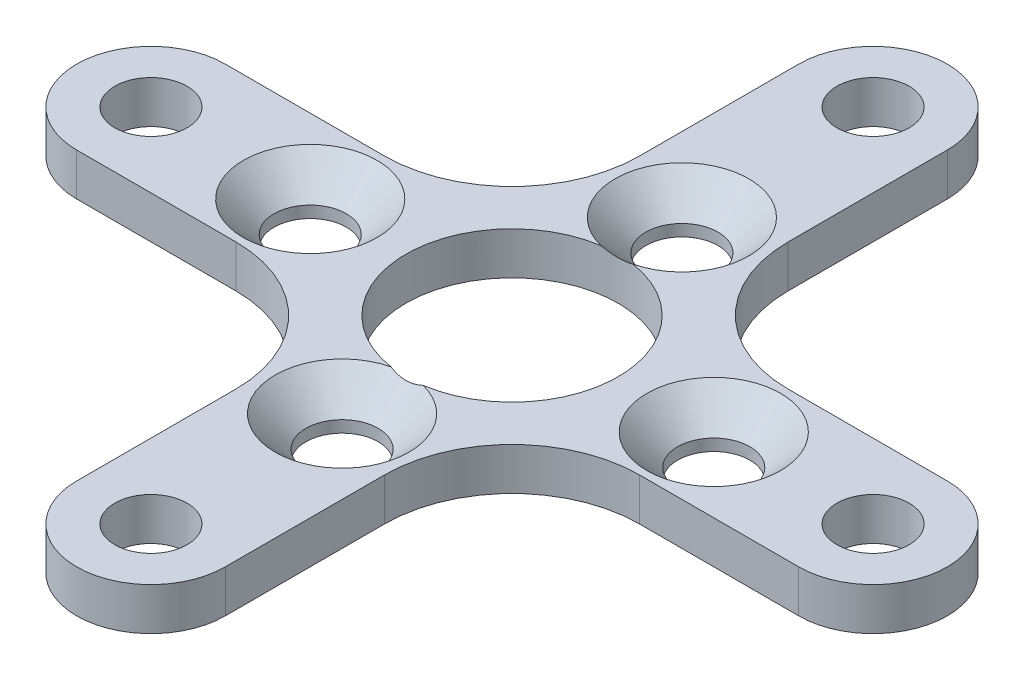
ISO-10303-21;
HEADER;
FILE_DESCRIPTION(('STEP AP214'),'2;1');
FILE_NAME('part.step','',(''),(''),'','','');
FILE_SCHEMA(('AUTOMOTIVE_DESIGN { 1 0 10303 214 1 1 1 1 }'));
ENDSEC;
DATA;
#1=APPLICATION_CONTEXT('core data for automotive mechanical design processes');
#2=APPLICATION_PROTOCOL_DEFINITION('international standard','automotive_design',2000,#1);
#3=PRODUCT_CONTEXT('',#1,'mechanical');
#4=PRODUCT('Part','Part','',(#3));
#5=PRODUCT_RELATED_PRODUCT_CATEGORY('part','',(#4));
#6=PRODUCT_DEFINITION_FORMATION('','',#4);
#7=PRODUCT_DEFINITION_CONTEXT('part definition',#1,'design');
#8=PRODUCT_DEFINITION('design','',#6,#7);
#9=PRODUCT_DEFINITION_SHAPE('','',#8);
#10=(LENGTH_UNIT() NAMED_UNIT(*) SI_UNIT(.MILLI.,.METRE.));
#11=(NAMED_UNIT(*) PLANE_ANGLE_UNIT() SI_UNIT($,.RADIAN.));
#12=(NAMED_UNIT(*) SI_UNIT($,.STERADIAN.) SOLID_ANGLE_UNIT());
#13=UNCERTAINTY_MEASURE_WITH_UNIT(LENGTH_MEASURE(1.E-05),#10,'distance_accuracy_value','');
#14=(GEOMETRIC_REPRESENTATION_CONTEXT(3) GLOBAL_UNCERTAINTY_ASSIGNED_CONTEXT((#13)) GLOBAL_UNIT_ASSIGNED_CONTEXT((#10,
#11,#12)) REPRESENTATION_CONTEXT('',''));
#15=CARTESIAN_POINT('',(0.,0.,0.));
#16=DIRECTION('',(0.,0.,1.));
#17=DIRECTION('',(1.,0.,0.));
#18=AXIS2_PLACEMENT_3D('',#15,#16,#17);
#19=CARTESIAN_POINT('',(9.5,2.,-9.5));
#20=DIRECTION('',(0.,-1.,0.));
#21=DIRECTION('',(0.,0.,-1.));
#22=AXIS2_PLACEMENT_3D('',#19,#20,#21);
#23=PLANE('',#22);
#24=CARTESIAN_POINT('',(-9.5,2.,0.));
#25=DIRECTION('',(0.,1.,0.));
#26=DIRECTION('',(0.,0.,1.));
#27=AXIS2_PLACEMENT_3D('',#24,#25,#26);
#28=CIRCLE('',#27,3.15);
#29=CARTESIAN_POINT('',(-9.5,2.,3.15));
#30=VERTEX_POINT('',#29);
#31=EDGE_CURVE('E554',#30,#30,#28,.T.);
#32=ORIENTED_EDGE('',*,*,#31,.F.);
#33=EDGE_LOOP('',(#32));
#34=FACE_BOUND('',#33,.T.);
#35=CARTESIAN_POINT('',(9.5,2.,0.));
#36=DIRECTION('',(0.,1.,0.));
#37=DIRECTION('',(0.,0.,1.));
#38=AXIS2_PLACEMENT_3D('',#35,#36,#37);
#39=CIRCLE('',#38,3.15);
#40=CARTESIAN_POINT('',(9.5,2.,3.15));
#41=VERTEX_POINT('',#40);
#42=EDGE_CURVE('E572',#41,#41,#39,.T.);
#43=ORIENTED_EDGE('',*,*,#42,.F.);
#44=EDGE_LOOP('',(#43));
#45=FACE_BOUND('',#44,.T.);
#46=CARTESIAN_POINT('',(0.,2.,-17.));
#47=DIRECTION('',(0.,1.,0.));
#48=DIRECTION('',(0.,0.,1.));
#49=AXIS2_PLACEMENT_3D('',#46,#47,#48);
#50=CIRCLE('',#49,1.7);
#51=CARTESIAN_POINT('',(0.,2.,-15.3));
#52=VERTEX_POINT('',#51);
#53=EDGE_CURVE('E581',#52,#52,#50,.T.);
#54=ORIENTED_EDGE('',*,*,#53,.F.);
#55=EDGE_LOOP('',(#54));
#56=FACE_BOUND('',#55,.T.);
#57=CARTESIAN_POINT('',(-17.,2.,0.));
#58=DIRECTION('',(0.,1.,0.));
#59=DIRECTION('',(0.,0.,1.));
#60=AXIS2_PLACEMENT_3D('',#57,#58,#59);
#61=CIRCLE('',#60,1.7);
#62=CARTESIAN_POINT('',(-17.,2.,1.7));
#63=VERTEX_POINT('',#62);
#64=EDGE_CURVE('E587',#63,#63,#61,.T.);
#65=ORIENTED_EDGE('',*,*,#64,.F.);
#66=EDGE_LOOP('',(#65));
#67=FACE_BOUND('',#66,.T.);
#68=CARTESIAN_POINT('',(17.,2.,0.));
#69=DIRECTION('',(0.,1.,0.));
#70=DIRECTION('',(0.,0.,1.));
#71=AXIS2_PLACEMENT_3D('',#68,#69,#70);
#72=CIRCLE('',#71,1.7);
#73=CARTESIAN_POINT('',(17.,2.,1.7));
#74=VERTEX_POINT('',#73);
#75=EDGE_CURVE('E593',#74,#74,#72,.T.);
#76=ORIENTED_EDGE('',*,*,#75,.F.);
#77=EDGE_LOOP('',(#76));
#78=FACE_BOUND('',#77,.T.);
#79=CARTESIAN_POINT('',(0.,2.,17.));
#80=DIRECTION('',(0.,1.,0.));
#81=DIRECTION('',(0.,0.,1.));
#82=AXIS2_PLACEMENT_3D('',#79,#80,#81);
#83=CIRCLE('',#82,1.7);
#84=CARTESIAN_POINT('',(0.,2.,18.7));
#85=VERTEX_POINT('',#84);
#86=EDGE_CURVE('E598',#85,#85,#83,.T.);
#87=ORIENTED_EDGE('',*,*,#86,.F.);
#88=EDGE_LOOP('',(#87));
#89=FACE_BOUND('',#88,.T.);
#90=CARTESIAN_POINT('',(9.5,2.,-9.5));
#91=DIRECTION('',(0.,-1.,0.));
#92=DIRECTION('',(0.,0.,-1.));
#93=AXIS2_PLACEMENT_3D('',#90,#91,#92);
#94=CIRCLE('',#93,6.);
#95=CARTESIAN_POINT('',(9.5,2.,-3.5));
#96=VERTEX_POINT('',#95);
#97=CARTESIAN_POINT('',(3.5,2.,-9.5));
#98=VERTEX_POINT('',#97);
#99=EDGE_CURVE('E188',#96,#98,#94,.T.);
#100=ORIENTED_EDGE('',*,*,#99,.T.);
#101=DIRECTION('',(0.,0.,-1.));
#102=VECTOR('',#101,1.);
#103=CARTESIAN_POINT('',(3.5,2.,-9.5));
#104=LINE('',#103,#102);
#105=CARTESIAN_POINT('',(3.5,2.,-17.));
#106=VERTEX_POINT('',#105);
#107=EDGE_CURVE('E191',#98,#106,#104,.T.);
#108=ORIENTED_EDGE('',*,*,#107,.T.);
#109=CARTESIAN_POINT('',(0.,2.,-17.));
#110=DIRECTION('',(0.,1.,0.));
#111=DIRECTION('',(0.,0.,1.));
#112=AXIS2_PLACEMENT_3D('',#109,#110,#111);
#113=CIRCLE('',#112,3.5);
#114=CARTESIAN_POINT('',(-3.5,2.,-17.));
#115=VERTEX_POINT('',#114);
#116=EDGE_CURVE('E194',#106,#115,#113,.T.);
#117=ORIENTED_EDGE('',*,*,#116,.T.);
#118=DIRECTION('',(0.,0.,1.));
#119=VECTOR('',#118,1.);
#120=CARTESIAN_POINT('',(-3.5,2.,-9.5));
#121=LINE('',#120,#119);
#122=CARTESIAN_POINT('',(-3.5,2.,-9.5));
#123=VERTEX_POINT('',#122);
#124=EDGE_CURVE('E196',#115,#123,#121,.T.);
#125=ORIENTED_EDGE('',*,*,#124,.T.);
#126=CARTESIAN_POINT('',(-9.5,2.,-9.5));
#127=DIRECTION('',(0.,-1.,0.));
#128=DIRECTION('',(0.,0.,1.));
#129=AXIS2_PLACEMENT_3D('',#126,#127,#128);
#130=CIRCLE('',#129,6.);
#131=CARTESIAN_POINT('',(-9.5,2.,-3.5));
#132=VERTEX_POINT('',#131);
#133=EDGE_CURVE('E198',#123,#132,#130,.T.);
#134=ORIENTED_EDGE('',*,*,#133,.T.);
#135=DIRECTION('',(-1.,0.,0.));
#136=VECTOR('',#135,1.);
#137=CARTESIAN_POINT('',(-9.5,2.,-3.5));
#138=LINE('',#137,#136);
#139=CARTESIAN_POINT('',(-17.,2.,-3.5));
#140=VERTEX_POINT('',#139);
#141=EDGE_CURVE('E200',#132,#140,#138,.T.);
#142=ORIENTED_EDGE('',*,*,#141,.T.);
#143=CARTESIAN_POINT('',(-17.,2.,0.));
#144=DIRECTION('',(0.,1.,0.));
#145=DIRECTION('',(0.,0.,1.));
#146=AXIS2_PLACEMENT_3D('',#143,#144,#145);
#147=CIRCLE('',#146,3.5);
#148=CARTESIAN_POINT('',(-17.,2.,3.5));
#149=VERTEX_POINT('',#148);
#150=EDGE_CURVE('E202',#140,#149,#147,.T.);
#151=ORIENTED_EDGE('',*,*,#150,.T.);
#152=DIRECTION('',(1.,0.,0.));
#153=VECTOR('',#152,1.);
#154=CARTESIAN_POINT('',(-9.5,2.,3.5));
#155=LINE('',#154,#153);
#156=CARTESIAN_POINT('',(-9.5,2.,3.5));
#157=VERTEX_POINT('',#156);
#158=EDGE_CURVE('E204',#149,#157,#155,.T.);
#159=ORIENTED_EDGE('',*,*,#158,.T.);
#160=CARTESIAN_POINT('',(-9.5,2.,9.5));
#161=DIRECTION('',(0.,-1.,0.));
#162=DIRECTION('',(0.,0.,-1.));
#163=AXIS2_PLACEMENT_3D('',#160,#161,#162);
#164=CIRCLE('',#163,6.);
#165=CARTESIAN_POINT('',(-3.5,2.,9.5));
#166=VERTEX_POINT('',#165);
#167=EDGE_CURVE('E206',#157,#166,#164,.T.);
#168=ORIENTED_EDGE('',*,*,#167,.T.);
#169=DIRECTION('',(0.,0.,1.));
#170=VECTOR('',#169,1.);
#171=CARTESIAN_POINT('',(-3.5,2.,9.5));
#172=LINE('',#171,#170);
#173=CARTESIAN_POINT('',(-3.5,2.,17.));
#174=VERTEX_POINT('',#173);
#175=EDGE_CURVE('E208',#166,#174,#172,.T.);
#176=ORIENTED_EDGE('',*,*,#175,.T.);
#177=CARTESIAN_POINT('',(0.,2.,17.));
#178=DIRECTION('',(0.,1.,0.));
#179=DIRECTION('',(0.,0.,-1.));
#180=AXIS2_PLACEMENT_3D('',#177,#178,#179);
#181=CIRCLE('',#180,3.5);
#182=CARTESIAN_POINT('',(3.5,2.,17.));
#183=VERTEX_POINT('',#182);
#184=EDGE_CURVE('E210',#174,#183,#181,.T.);
#185=ORIENTED_EDGE('',*,*,#184,.T.);
#186=DIRECTION('',(0.,0.,-1.));
#187=VECTOR('',#186,1.);
#188=CARTESIAN_POINT('',(3.5,2.,9.5));
#189=LINE('',#188,#187);
#190=CARTESIAN_POINT('',(3.5,2.,9.5));
#191=VERTEX_POINT('',#190);
#192=EDGE_CURVE('E212',#183,#191,#189,.T.);
#193=ORIENTED_EDGE('',*,*,#192,.T.);
#194=CARTESIAN_POINT('',(9.5,2.,9.5));
#195=DIRECTION('',(0.,-1.,0.));
#196=DIRECTION('',(0.,0.,1.));
#197=AXIS2_PLACEMENT_3D('',#194,#195,#196);
#198=CIRCLE('',#197,6.);
#199=CARTESIAN_POINT('',(9.5,2.,3.5));
#200=VERTEX_POINT('',#199);
#201=EDGE_CURVE('E214',#191,#200,#198,.T.);
#202=ORIENTED_EDGE('',*,*,#201,.T.);
#203=DIRECTION('',(1.,0.,0.));
#204=VECTOR('',#203,1.);
#205=CARTESIAN_POINT('',(9.5,2.,3.5));
#206=LINE('',#205,#204);
#207=CARTESIAN_POINT('',(17.,2.,3.5));
#208=VERTEX_POINT('',#207);
#209=EDGE_CURVE('E216',#200,#208,#206,.T.);
#210=ORIENTED_EDGE('',*,*,#209,.T.);
#211=CARTESIAN_POINT('',(17.,2.,0.));
#212=DIRECTION('',(0.,1.,0.));
#213=DIRECTION('',(0.,0.,-1.));
#214=AXIS2_PLACEMENT_3D('',#211,#212,#213);
#215=CIRCLE('',#214,3.5);
#216=CARTESIAN_POINT('',(17.,2.,-3.5));
#217=VERTEX_POINT('',#216);
#218=EDGE_CURVE('E218',#208,#217,#215,.T.);
#219=ORIENTED_EDGE('',*,*,#218,.T.);
#220=DIRECTION('',(-1.,0.,0.));
#221=VECTOR('',#220,1.);
#222=CARTESIAN_POINT('',(9.5,2.,-3.5));
#223=LINE('',#222,#221);
#224=EDGE_CURVE('E220',#217,#96,#223,.T.);
#225=ORIENTED_EDGE('',*,*,#224,.T.);
#226=EDGE_LOOP('',(#100,#108,#117,#125,#134,#142,#151,#159,#168,#176,#185,#193,#202,#210,#219,#225));
#227=FACE_BOUND('',#226,.T.);
#228=CARTESIAN_POINT('',(0.,2.,0.));
#229=DIRECTION('',(0.,1.,0.));
#230=DIRECTION('',(0.,0.,1.));
#231=AXIS2_PLACEMENT_3D('',#228,#229,#230);
#232=CIRCLE('',#231,5.);
#233=CARTESIAN_POINT('',(-0.757124994195753,2.,-4.94234375));
#234=VERTEX_POINT('',#233);
#235=CARTESIAN_POINT('',(-0.757124994195761,2.,4.94234375));
#236=VERTEX_POINT('',#235);
#237=EDGE_CURVE('E171',#234,#236,#232,.T.);
#238=ORIENTED_EDGE('',*,*,#237,.F.);
#239=CARTESIAN_POINT('',(0.,2.,-8.));
#240=DIRECTION('',(0.,1.,0.));
#241=DIRECTION('',(0.,0.,1.));
#242=AXIS2_PLACEMENT_3D('',#239,#240,#241);
#243=CIRCLE('',#242,3.15);
#244=CARTESIAN_POINT('',(0.757124994195761,2.,-4.94234375));
#245=VERTEX_POINT('',#244);
#246=EDGE_CURVE('E54',#245,#234,#243,.T.);
#247=ORIENTED_EDGE('',*,*,#246,.F.);
#248=CARTESIAN_POINT('',(0.757124994195754,2.,4.94234375));
#249=VERTEX_POINT('',#248);
#250=EDGE_CURVE('E170',#249,#245,#232,.T.);
#251=ORIENTED_EDGE('',*,*,#250,.F.);
#252=CARTESIAN_POINT('',(0.,2.,8.));
#253=DIRECTION('',(0.,1.,0.));
#254=DIRECTION('',(0.,0.,1.));
#255=AXIS2_PLACEMENT_3D('',#252,#253,#254);
#256=CIRCLE('',#255,3.15);
#257=EDGE_CURVE('E61',#236,#249,#256,.T.);
#258=ORIENTED_EDGE('',*,*,#257,.F.);
#259=EDGE_LOOP('',(#238,#247,#251,#258));
#260=FACE_BOUND('',#259,.T.);
#261=ADVANCED_FACE('F35',(#34,#45,#56,#67,#78,#89,#227,#260),#23,.F.);
#262=CARTESIAN_POINT('',(9.5,0.,-9.5));
#263=DIRECTION('',(0.,-1.,0.));
#264=DIRECTION('',(0.,0.,-1.));
#265=AXIS2_PLACEMENT_3D('',#262,#263,#264);
#266=PLANE('',#265);
#267=CARTESIAN_POINT('',(0.,0.,-8.));
#268=DIRECTION('',(0.,1.,0.));
#269=DIRECTION('',(0.,0.,1.));
#270=AXIS2_PLACEMENT_3D('',#267,#268,#269);
#271=CIRCLE('',#270,1.69999999999999);
#272=CARTESIAN_POINT('',(0.,0.,-6.30000000000001));
#273=VERTEX_POINT('',#272);
#274=EDGE_CURVE('E550',#273,#273,#271,.T.);
#275=ORIENTED_EDGE('',*,*,#274,.T.);
#276=EDGE_LOOP('',(#275));
#277=FACE_BOUND('',#276,.T.);
#278=CARTESIAN_POINT('',(-9.5,0.,0.));
#279=DIRECTION('',(0.,1.,0.));
#280=DIRECTION('',(0.,0.,1.));
#281=AXIS2_PLACEMENT_3D('',#278,#279,#280);
#282=CIRCLE('',#281,1.69999999999999);
#283=CARTESIAN_POINT('',(-9.5,0.,1.69999999999999));
#284=VERTEX_POINT('',#283);
#285=EDGE_CURVE('E562',#284,#284,#282,.T.);
#286=ORIENTED_EDGE('',*,*,#285,.T.);
#287=EDGE_LOOP('',(#286));
#288=FACE_BOUND('',#287,.T.);
#289=CARTESIAN_POINT('',(0.,0.,8.));
#290=DIRECTION('',(0.,1.,0.));
#291=DIRECTION('',(0.,0.,1.));
#292=AXIS2_PLACEMENT_3D('',#289,#290,#291);
#293=CIRCLE('',#292,1.69999999999999);
#294=CARTESIAN_POINT('',(0.,0.,9.69999999999999));
#295=VERTEX_POINT('',#294);
#296=EDGE_CURVE('E569',#295,#295,#293,.T.);
#297=ORIENTED_EDGE('',*,*,#296,.T.);
#298=EDGE_LOOP('',(#297));
#299=FACE_BOUND('',#298,.T.);
#300=CARTESIAN_POINT('',(9.5,0.,0.));
#301=DIRECTION('',(0.,1.,0.));
#302=DIRECTION('',(0.,0.,1.));
#303=AXIS2_PLACEMENT_3D('',#300,#301,#302);
#304=CIRCLE('',#303,1.69999999999999);
#305=CARTESIAN_POINT('',(9.5,0.,1.69999999999999));
#306=VERTEX_POINT('',#305);
#307=EDGE_CURVE('E578',#306,#306,#304,.T.);
#308=ORIENTED_EDGE('',*,*,#307,.T.);
#309=EDGE_LOOP('',(#308));
#310=FACE_BOUND('',#309,.T.);
#311=CARTESIAN_POINT('',(0.,0.,-17.));
#312=DIRECTION('',(0.,1.,0.));
#313=DIRECTION('',(0.,0.,1.));
#314=AXIS2_PLACEMENT_3D('',#311,#312,#313);
#315=CIRCLE('',#314,1.7);
#316=CARTESIAN_POINT('',(0.,0.,-15.3));
#317=VERTEX_POINT('',#316);
#318=EDGE_CURVE('E584',#317,#317,#315,.T.);
#319=ORIENTED_EDGE('',*,*,#318,.T.);
#320=EDGE_LOOP('',(#319));
#321=FACE_BOUND('',#320,.T.);
#322=CARTESIAN_POINT('',(-17.,0.,0.));
#323=DIRECTION('',(0.,1.,0.));
#324=DIRECTION('',(0.,0.,1.));
#325=AXIS2_PLACEMENT_3D('',#322,#323,#324);
#326=CIRCLE('',#325,1.7);
#327=CARTESIAN_POINT('',(-17.,0.,1.7));
#328=VERTEX_POINT('',#327);
#329=EDGE_CURVE('E590',#328,#328,#326,.T.);
#330=ORIENTED_EDGE('',*,*,#329,.T.);
#331=EDGE_LOOP('',(#330));
#332=FACE_BOUND('',#331,.T.);
#333=CARTESIAN_POINT('',(17.,0.,0.));
#334=DIRECTION('',(0.,1.,0.));
#335=DIRECTION('',(0.,0.,1.));
#336=AXIS2_PLACEMENT_3D('',#333,#334,#335);
#337=CIRCLE('',#336,1.7);
#338=CARTESIAN_POINT('',(17.,0.,1.7));
#339=VERTEX_POINT('',#338);
#340=EDGE_CURVE('E596',#339,#339,#337,.T.);
#341=ORIENTED_EDGE('',*,*,#340,.T.);
#342=EDGE_LOOP('',(#341));
#343=FACE_BOUND('',#342,.T.);
#344=CARTESIAN_POINT('',(0.,0.,17.));
#345=DIRECTION('',(0.,1.,0.));
#346=DIRECTION('',(0.,0.,1.));
#347=AXIS2_PLACEMENT_3D('',#344,#345,#346);
#348=CIRCLE('',#347,1.7);
#349=CARTESIAN_POINT('',(0.,0.,18.7));
#350=VERTEX_POINT('',#349);
#351=EDGE_CURVE('E184',#350,#350,#348,.T.);
#352=ORIENTED_EDGE('',*,*,#351,.T.);
#353=EDGE_LOOP('',(#352));
#354=FACE_BOUND('',#353,.T.);
#355=CARTESIAN_POINT('',(9.5,0.,-9.5));
#356=DIRECTION('',(0.,-1.,0.));
#357=DIRECTION('',(0.,0.,-1.));
#358=AXIS2_PLACEMENT_3D('',#355,#356,#357);
#359=CIRCLE('',#358,6.);
#360=CARTESIAN_POINT('',(9.5,0.,-3.5));
#361=VERTEX_POINT('',#360);
#362=CARTESIAN_POINT('',(3.5,0.,-9.5));
#363=VERTEX_POINT('',#362);
#364=EDGE_CURVE('E176',#361,#363,#359,.T.);
#365=ORIENTED_EDGE('',*,*,#364,.F.);
#366=DIRECTION('',(-1.,0.,0.));
#367=VECTOR('',#366,1.);
#368=CARTESIAN_POINT('',(9.5,0.,-3.5));
#369=LINE('',#368,#367);
#370=CARTESIAN_POINT('',(17.,0.,-3.5));
#371=VERTEX_POINT('',#370);
#372=EDGE_CURVE('E192',#371,#361,#369,.T.);
#373=ORIENTED_EDGE('',*,*,#372,.F.);
#374=CARTESIAN_POINT('',(17.,0.,0.));
#375=DIRECTION('',(0.,1.,0.));
#376=DIRECTION('',(0.,0.,-1.));
#377=AXIS2_PLACEMENT_3D('',#374,#375,#376);
#378=CIRCLE('',#377,3.5);
#379=CARTESIAN_POINT('',(17.,0.,3.5));
#380=VERTEX_POINT('',#379);
#381=EDGE_CURVE('E248',#380,#371,#378,.T.);
#382=ORIENTED_EDGE('',*,*,#381,.F.);
#383=DIRECTION('',(1.,0.,0.));
#384=VECTOR('',#383,1.);
#385=CARTESIAN_POINT('',(9.5,0.,3.5));
#386=LINE('',#385,#384);
#387=CARTESIAN_POINT('',(9.5,0.,3.5));
#388=VERTEX_POINT('',#387);
#389=EDGE_CURVE('E246',#388,#380,#386,.T.);
#390=ORIENTED_EDGE('',*,*,#389,.F.);
#391=CARTESIAN_POINT('',(9.5,0.,9.5));
#392=DIRECTION('',(0.,-1.,0.));
#393=DIRECTION('',(0.,0.,1.));
#394=AXIS2_PLACEMENT_3D('',#391,#392,#393);
#395=CIRCLE('',#394,6.);
#396=CARTESIAN_POINT('',(3.5,0.,9.5));
#397=VERTEX_POINT('',#396);
#398=EDGE_CURVE('E244',#397,#388,#395,.T.);
#399=ORIENTED_EDGE('',*,*,#398,.F.);
#400=DIRECTION('',(0.,0.,-1.));
#401=VECTOR('',#400,1.);
#402=CARTESIAN_POINT('',(3.5,0.,9.5));
#403=LINE('',#402,#401);
#404=CARTESIAN_POINT('',(3.5,0.,17.));
#405=VERTEX_POINT('',#404);
#406=EDGE_CURVE('E242',#405,#397,#403,.T.);
#407=ORIENTED_EDGE('',*,*,#406,.F.);
#408=CARTESIAN_POINT('',(0.,0.,17.));
#409=DIRECTION('',(0.,1.,0.));
#410=DIRECTION('',(0.,0.,-1.));
#411=AXIS2_PLACEMENT_3D('',#408,#409,#410);
#412=CIRCLE('',#411,3.5);
#413=CARTESIAN_POINT('',(-3.5,0.,17.));
#414=VERTEX_POINT('',#413);
#415=EDGE_CURVE('E240',#414,#405,#412,.T.);
#416=ORIENTED_EDGE('',*,*,#415,.F.);
#417=DIRECTION('',(0.,0.,1.));
#418=VECTOR('',#417,1.);
#419=CARTESIAN_POINT('',(-3.5,0.,9.5));
#420=LINE('',#419,#418);
#421=CARTESIAN_POINT('',(-3.5,0.,9.5));
#422=VERTEX_POINT('',#421);
#423=EDGE_CURVE('E238',#422,#414,#420,.T.);
#424=ORIENTED_EDGE('',*,*,#423,.F.);
#425=CARTESIAN_POINT('',(-9.5,0.,9.5));
#426=DIRECTION('',(0.,-1.,0.));
#427=DIRECTION('',(0.,0.,-1.));
#428=AXIS2_PLACEMENT_3D('',#425,#426,#427);
#429=CIRCLE('',#428,6.);
#430=CARTESIAN_POINT('',(-9.5,0.,3.5));
#431=VERTEX_POINT('',#430);
#432=EDGE_CURVE('E236',#431,#422,#429,.T.);
#433=ORIENTED_EDGE('',*,*,#432,.F.);
#434=DIRECTION('',(1.,0.,0.));
#435=VECTOR('',#434,1.);
#436=CARTESIAN_POINT('',(-9.5,0.,3.5));
#437=LINE('',#436,#435);
#438=CARTESIAN_POINT('',(-17.,0.,3.5));
#439=VERTEX_POINT('',#438);
#440=EDGE_CURVE('E234',#439,#431,#437,.T.);
#441=ORIENTED_EDGE('',*,*,#440,.F.);
#442=CARTESIAN_POINT('',(-17.,0.,0.));
#443=DIRECTION('',(0.,1.,0.));
#444=DIRECTION('',(0.,0.,1.));
#445=AXIS2_PLACEMENT_3D('',#442,#443,#444);
#446=CIRCLE('',#445,3.5);
#447=CARTESIAN_POINT('',(-17.,0.,-3.5));
#448=VERTEX_POINT('',#447);
#449=EDGE_CURVE('E232',#448,#439,#446,.T.);
#450=ORIENTED_EDGE('',*,*,#449,.F.);
#451=DIRECTION('',(-1.,0.,0.));
#452=VECTOR('',#451,1.);
#453=CARTESIAN_POINT('',(-9.5,0.,-3.5));
#454=LINE('',#453,#452);
#455=CARTESIAN_POINT('',(-9.5,0.,-3.5));
#456=VERTEX_POINT('',#455);
#457=EDGE_CURVE('E230',#456,#448,#454,.T.);
#458=ORIENTED_EDGE('',*,*,#457,.F.);
#459=CARTESIAN_POINT('',(-9.5,0.,-9.5));
#460=DIRECTION('',(0.,-1.,0.));
#461=DIRECTION('',(0.,0.,1.));
#462=AXIS2_PLACEMENT_3D('',#459,#460,#461);
#463=CIRCLE('',#462,6.);
#464=CARTESIAN_POINT('',(-3.5,0.,-9.5));
#465=VERTEX_POINT('',#464);
#466=EDGE_CURVE('E228',#465,#456,#463,.T.);
#467=ORIENTED_EDGE('',*,*,#466,.F.);
#468=DIRECTION('',(0.,0.,1.));
#469=VECTOR('',#468,1.);
#470=CARTESIAN_POINT('',(-3.5,0.,-9.5));
#471=LINE('',#470,#469);
#472=CARTESIAN_POINT('',(-3.5,0.,-17.));
#473=VERTEX_POINT('',#472);
#474=EDGE_CURVE('E226',#473,#465,#471,.T.);
#475=ORIENTED_EDGE('',*,*,#474,.F.);
#476=CARTESIAN_POINT('',(0.,0.,-17.));
#477=DIRECTION('',(0.,1.,0.));
#478=DIRECTION('',(0.,0.,1.));
#479=AXIS2_PLACEMENT_3D('',#476,#477,#478);
#480=CIRCLE('',#479,3.5);
#481=CARTESIAN_POINT('',(3.5,0.,-17.));
#482=VERTEX_POINT('',#481);
#483=EDGE_CURVE('E224',#482,#473,#480,.T.);
#484=ORIENTED_EDGE('',*,*,#483,.F.);
#485=DIRECTION('',(0.,0.,-1.));
#486=VECTOR('',#485,1.);
#487=CARTESIAN_POINT('',(3.5,0.,-9.5));
#488=LINE('',#487,#486);
#489=EDGE_CURVE('E179',#363,#482,#488,.T.);
#490=ORIENTED_EDGE('',*,*,#489,.F.);
#491=EDGE_LOOP('',(#365,#373,#382,#390,#399,#407,#416,#424,#433,#441,#450,#458,#467,#475,#484,#490));
#492=FACE_BOUND('',#491,.T.);
#493=CARTESIAN_POINT('',(0.,0.,0.));
#494=DIRECTION('',(0.,1.,0.));
#495=DIRECTION('',(0.,0.,1.));
#496=AXIS2_PLACEMENT_3D('',#493,#494,#495);
#497=CIRCLE('',#496,5.);
#498=CARTESIAN_POINT('',(0.,0.,5.));
#499=VERTEX_POINT('',#498);
#500=EDGE_CURVE('E181',#499,#499,#497,.T.);
#501=ORIENTED_EDGE('',*,*,#500,.T.);
#502=EDGE_LOOP('',(#501));
#503=FACE_BOUND('',#502,.T.);
#504=ADVANCED_FACE('F345',(#277,#288,#299,#310,#321,#332,#343,#354,#492,#503),#266,.T.);
#505=CARTESIAN_POINT('',(9.5,2.,-9.5));
#506=DIRECTION('',(0.,-1.,0.));
#507=DIRECTION('',(0.,0.,-1.));
#508=AXIS2_PLACEMENT_3D('',#505,#506,#507);
#509=CYLINDRICAL_SURFACE('',#508,6.);
#510=ORIENTED_EDGE('',*,*,#364,.T.);
#511=DIRECTION('',(0.,-1.,0.));
#512=VECTOR('',#511,1.);
#513=CARTESIAN_POINT('',(3.5,2.,-9.5));
#514=LINE('',#513,#512);
#515=EDGE_CURVE('E295',#98,#363,#514,.T.);
#516=ORIENTED_EDGE('',*,*,#515,.F.);
#517=ORIENTED_EDGE('',*,*,#99,.F.);
#518=DIRECTION('',(0.,-1.,0.));
#519=VECTOR('',#518,1.);
#520=CARTESIAN_POINT('',(9.5,2.,-3.5));
#521=LINE('',#520,#519);
#522=EDGE_CURVE('E221',#96,#361,#521,.T.);
#523=ORIENTED_EDGE('',*,*,#522,.T.);
#524=EDGE_LOOP('',(#510,#516,#517,#523));
#525=FACE_BOUND('',#524,.T.);
#526=ADVANCED_FACE('F37',(#525),#509,.F.);
#527=CARTESIAN_POINT('',(3.5,2.,-9.5));
#528=DIRECTION('',(-1.,0.,0.));
#529=DIRECTION('',(0.,0.,1.));
#530=AXIS2_PLACEMENT_3D('',#527,#528,#529);
#531=PLANE('',#530);
#532=ORIENTED_EDGE('',*,*,#489,.T.);
#533=DIRECTION('',(0.,-1.,0.));
#534=VECTOR('',#533,1.);
#535=CARTESIAN_POINT('',(3.5,2.,-17.));
#536=LINE('',#535,#534);
#537=EDGE_CURVE('E292',#106,#482,#536,.T.);
#538=ORIENTED_EDGE('',*,*,#537,.F.);
#539=ORIENTED_EDGE('',*,*,#107,.F.);
#540=ORIENTED_EDGE('',*,*,#515,.T.);
#541=EDGE_LOOP('',(#532,#538,#539,#540));
#542=FACE_BOUND('',#541,.T.);
#543=ADVANCED_FACE('F408',(#542),#531,.F.);
#544=CARTESIAN_POINT('',(0.,2.,-17.));
#545=DIRECTION('',(0.,-1.,0.));
#546=DIRECTION('',(0.,0.,-1.));
#547=AXIS2_PLACEMENT_3D('',#544,#545,#546);
#548=CYLINDRICAL_SURFACE('',#547,3.5);
#549=ORIENTED_EDGE('',*,*,#483,.T.);
#550=DIRECTION('',(0.,-1.,0.));
#551=VECTOR('',#550,1.);
#552=CARTESIAN_POINT('',(-3.5,2.,-17.));
#553=LINE('',#552,#551);
#554=EDGE_CURVE('E289',#115,#473,#553,.T.);
#555=ORIENTED_EDGE('',*,*,#554,.F.);
#556=ORIENTED_EDGE('',*,*,#116,.F.);
#557=ORIENTED_EDGE('',*,*,#537,.T.);
#558=EDGE_LOOP('',(#549,#555,#556,#557));
#559=FACE_BOUND('',#558,.T.);
#560=ADVANCED_FACE('F405',(#559),#548,.T.);
#561=CARTESIAN_POINT('',(-3.5,2.,-9.5));
#562=DIRECTION('',(1.,0.,0.));
#563=DIRECTION('',(0.,0.,-1.));
#564=AXIS2_PLACEMENT_3D('',#561,#562,#563);
#565=PLANE('',#564);
#566=ORIENTED_EDGE('',*,*,#474,.T.);
#567=DIRECTION('',(0.,-1.,0.));
#568=VECTOR('',#567,1.);
#569=CARTESIAN_POINT('',(-3.5,2.,-9.5));
#570=LINE('',#569,#568);
#571=EDGE_CURVE('E286',#123,#465,#570,.T.);
#572=ORIENTED_EDGE('',*,*,#571,.F.);
#573=ORIENTED_EDGE('',*,*,#124,.F.);
#574=ORIENTED_EDGE('',*,*,#554,.T.);
#575=EDGE_LOOP('',(#566,#572,#573,#574));
#576=FACE_BOUND('',#575,.T.);
#577=ADVANCED_FACE('F401',(#576),#565,.F.);
#578=CARTESIAN_POINT('',(-9.5,2.,-9.5));
#579=DIRECTION('',(0.,-1.,0.));
#580=DIRECTION('',(0.,0.,-1.));
#581=AXIS2_PLACEMENT_3D('',#578,#579,#580);
#582=CYLINDRICAL_SURFACE('',#581,6.);
#583=ORIENTED_EDGE('',*,*,#466,.T.);
#584=DIRECTION('',(0.,-1.,0.));
#585=VECTOR('',#584,1.);
#586=CARTESIAN_POINT('',(-9.5,2.,-3.5));
#587=LINE('',#586,#585);
#588=EDGE_CURVE('E283',#132,#456,#587,.T.);
#589=ORIENTED_EDGE('',*,*,#588,.F.);
#590=ORIENTED_EDGE('',*,*,#133,.F.);
#591=ORIENTED_EDGE('',*,*,#571,.T.);
#592=EDGE_LOOP('',(#583,#589,#590,#591));
#593=FACE_BOUND('',#592,.T.);
#594=ADVANCED_FACE('F397',(#593),#582,.F.);
#595=CARTESIAN_POINT('',(-9.5,2.,-3.5));
#596=DIRECTION('',(0.,0.,1.));
#597=DIRECTION('',(1.,0.,0.));
#598=AXIS2_PLACEMENT_3D('',#595,#596,#597);
#599=PLANE('',#598);
#600=ORIENTED_EDGE('',*,*,#457,.T.);
#601=DIRECTION('',(0.,-1.,0.));
#602=VECTOR('',#601,1.);
#603=CARTESIAN_POINT('',(-17.,2.,-3.5));
#604=LINE('',#603,#602);
#605=EDGE_CURVE('E280',#140,#448,#604,.T.);
#606=ORIENTED_EDGE('',*,*,#605,.F.);
#607=ORIENTED_EDGE('',*,*,#141,.F.);
#608=ORIENTED_EDGE('',*,*,#588,.T.);
#609=EDGE_LOOP('',(#600,#606,#607,#608));
#610=FACE_BOUND('',#609,.T.);
#611=ADVANCED_FACE('F393',(#610),#599,.F.);
#612=CARTESIAN_POINT('',(-17.,2.,0.));
#613=DIRECTION('',(0.,-1.,0.));
#614=DIRECTION('',(0.,0.,-1.));
#615=AXIS2_PLACEMENT_3D('',#612,#613,#614);
#616=CYLINDRICAL_SURFACE('',#615,3.5);
#617=ORIENTED_EDGE('',*,*,#449,.T.);
#618=DIRECTION('',(0.,-1.,0.));
#619=VECTOR('',#618,1.);
#620=CARTESIAN_POINT('',(-17.,2.,3.5));
#621=LINE('',#620,#619);
#622=EDGE_CURVE('E277',#149,#439,#621,.T.);
#623=ORIENTED_EDGE('',*,*,#622,.F.);
#624=ORIENTED_EDGE('',*,*,#150,.F.);
#625=ORIENTED_EDGE('',*,*,#605,.T.);
#626=EDGE_LOOP('',(#617,#623,#624,#625));
#627=FACE_BOUND('',#626,.T.);
#628=ADVANCED_FACE('F389',(#627),#616,.T.);
#629=CARTESIAN_POINT('',(-9.5,2.,3.5));
#630=DIRECTION('',(0.,0.,-1.));
#631=DIRECTION('',(-1.,0.,0.));
#632=AXIS2_PLACEMENT_3D('',#629,#630,#631);
#633=PLANE('',#632);
#634=ORIENTED_EDGE('',*,*,#440,.T.);
#635=DIRECTION('',(0.,-1.,0.));
#636=VECTOR('',#635,1.);
#637=CARTESIAN_POINT('',(-9.5,2.,3.5));
#638=LINE('',#637,#636);
#639=EDGE_CURVE('E274',#157,#431,#638,.T.);
#640=ORIENTED_EDGE('',*,*,#639,.F.);
#641=ORIENTED_EDGE('',*,*,#158,.F.);
#642=ORIENTED_EDGE('',*,*,#622,.T.);
#643=EDGE_LOOP('',(#634,#640,#641,#642));
#644=FACE_BOUND('',#643,.T.);
#645=ADVANCED_FACE('F385',(#644),#633,.F.);
#646=CARTESIAN_POINT('',(-9.5,2.,9.5));
#647=DIRECTION('',(0.,-1.,0.));
#648=DIRECTION('',(0.,0.,-1.));
#649=AXIS2_PLACEMENT_3D('',#646,#647,#648);
#650=CYLINDRICAL_SURFACE('',#649,6.);
#651=ORIENTED_EDGE('',*,*,#432,.T.);
#652=DIRECTION('',(0.,-1.,0.));
#653=VECTOR('',#652,1.);
#654=CARTESIAN_POINT('',(-3.5,2.,9.5));
#655=LINE('',#654,#653);
#656=EDGE_CURVE('E271',#166,#422,#655,.T.);
#657=ORIENTED_EDGE('',*,*,#656,.F.);
#658=ORIENTED_EDGE('',*,*,#167,.F.);
#659=ORIENTED_EDGE('',*,*,#639,.T.);
#660=EDGE_LOOP('',(#651,#657,#658,#659));
#661=FACE_BOUND('',#660,.T.);
#662=ADVANCED_FACE('F381',(#661),#650,.F.);
#663=CARTESIAN_POINT('',(-3.5,2.,9.5));
#664=DIRECTION('',(1.,0.,0.));
#665=DIRECTION('',(0.,0.,-1.));
#666=AXIS2_PLACEMENT_3D('',#663,#664,#665);
#667=PLANE('',#666);
#668=ORIENTED_EDGE('',*,*,#423,.T.);
#669=DIRECTION('',(0.,-1.,0.));
#670=VECTOR('',#669,1.);
#671=CARTESIAN_POINT('',(-3.5,2.,17.));
#672=LINE('',#671,#670);
#673=EDGE_CURVE('E268',#174,#414,#672,.T.);
#674=ORIENTED_EDGE('',*,*,#673,.F.);
#675=ORIENTED_EDGE('',*,*,#175,.F.);
#676=ORIENTED_EDGE('',*,*,#656,.T.);
#677=EDGE_LOOP('',(#668,#674,#675,#676));
#678=FACE_BOUND('',#677,.T.);
#679=ADVANCED_FACE('F377',(#678),#667,.F.);
#680=CARTESIAN_POINT('',(0.,2.,17.));
#681=DIRECTION('',(0.,-1.,0.));
#682=DIRECTION('',(0.,0.,-1.));
#683=AXIS2_PLACEMENT_3D('',#680,#681,#682);
#684=CYLINDRICAL_SURFACE('',#683,3.5);
#685=ORIENTED_EDGE('',*,*,#415,.T.);
#686=DIRECTION('',(0.,-1.,0.));
#687=VECTOR('',#686,1.);
#688=CARTESIAN_POINT('',(3.5,2.,17.));
#689=LINE('',#688,#687);
#690=EDGE_CURVE('E265',#183,#405,#689,.T.);
#691=ORIENTED_EDGE('',*,*,#690,.F.);
#692=ORIENTED_EDGE('',*,*,#184,.F.);
#693=ORIENTED_EDGE('',*,*,#673,.T.);
#694=EDGE_LOOP('',(#685,#691,#692,#693));
#695=FACE_BOUND('',#694,.T.);
#696=ADVANCED_FACE('F373',(#695),#684,.T.);
#697=CARTESIAN_POINT('',(3.5,2.,9.5));
#698=DIRECTION('',(-1.,0.,0.));
#699=DIRECTION('',(0.,0.,1.));
#700=AXIS2_PLACEMENT_3D('',#697,#698,#699);
#701=PLANE('',#700);
#702=ORIENTED_EDGE('',*,*,#406,.T.);
#703=DIRECTION('',(0.,-1.,0.));
#704=VECTOR('',#703,1.);
#705=CARTESIAN_POINT('',(3.5,2.,9.5));
#706=LINE('',#705,#704);
#707=EDGE_CURVE('E262',#191,#397,#706,.T.);
#708=ORIENTED_EDGE('',*,*,#707,.F.);
#709=ORIENTED_EDGE('',*,*,#192,.F.);
#710=ORIENTED_EDGE('',*,*,#690,.T.);
#711=EDGE_LOOP('',(#702,#708,#709,#710));
#712=FACE_BOUND('',#711,.T.);
#713=ADVANCED_FACE('F369',(#712),#701,.F.);
#714=CARTESIAN_POINT('',(9.5,2.,9.5));
#715=DIRECTION('',(0.,-1.,0.));
#716=DIRECTION('',(0.,0.,-1.));
#717=AXIS2_PLACEMENT_3D('',#714,#715,#716);
#718=CYLINDRICAL_SURFACE('',#717,6.);
#719=ORIENTED_EDGE('',*,*,#398,.T.);
#720=DIRECTION('',(0.,-1.,0.));
#721=VECTOR('',#720,1.);
#722=CARTESIAN_POINT('',(9.5,2.,3.5));
#723=LINE('',#722,#721);
#724=EDGE_CURVE('E259',#200,#388,#723,.T.);
#725=ORIENTED_EDGE('',*,*,#724,.F.);
#726=ORIENTED_EDGE('',*,*,#201,.F.);
#727=ORIENTED_EDGE('',*,*,#707,.T.);
#728=EDGE_LOOP('',(#719,#725,#726,#727));
#729=FACE_BOUND('',#728,.T.);
#730=ADVANCED_FACE('F365',(#729),#718,.F.);
#731=CARTESIAN_POINT('',(9.5,2.,3.5));
#732=DIRECTION('',(0.,0.,-1.));
#733=DIRECTION('',(-1.,0.,0.));
#734=AXIS2_PLACEMENT_3D('',#731,#732,#733);
#735=PLANE('',#734);
#736=ORIENTED_EDGE('',*,*,#389,.T.);
#737=DIRECTION('',(0.,-1.,0.));
#738=VECTOR('',#737,1.);
#739=CARTESIAN_POINT('',(17.,2.,3.5));
#740=LINE('',#739,#738);
#741=EDGE_CURVE('E256',#208,#380,#740,.T.);
#742=ORIENTED_EDGE('',*,*,#741,.F.);
#743=ORIENTED_EDGE('',*,*,#209,.F.);
#744=ORIENTED_EDGE('',*,*,#724,.T.);
#745=EDGE_LOOP('',(#736,#742,#743,#744));
#746=FACE_BOUND('',#745,.T.);
#747=ADVANCED_FACE('F361',(#746),#735,.F.);
#748=CARTESIAN_POINT('',(17.,2.,0.));
#749=DIRECTION('',(0.,-1.,0.));
#750=DIRECTION('',(0.,0.,-1.));
#751=AXIS2_PLACEMENT_3D('',#748,#749,#750);
#752=CYLINDRICAL_SURFACE('',#751,3.5);
#753=ORIENTED_EDGE('',*,*,#381,.T.);
#754=DIRECTION('',(0.,-1.,0.));
#755=VECTOR('',#754,1.);
#756=CARTESIAN_POINT('',(17.,2.,-3.5));
#757=LINE('',#756,#755);
#758=EDGE_CURVE('E253',#217,#371,#757,.T.);
#759=ORIENTED_EDGE('',*,*,#758,.F.);
#760=ORIENTED_EDGE('',*,*,#218,.F.);
#761=ORIENTED_EDGE('',*,*,#741,.T.);
#762=EDGE_LOOP('',(#753,#759,#760,#761));
#763=FACE_BOUND('',#762,.T.);
#764=ADVANCED_FACE('F357',(#763),#752,.T.);
#765=CARTESIAN_POINT('',(9.5,2.,-3.5));
#766=DIRECTION('',(0.,0.,1.));
#767=DIRECTION('',(1.,0.,0.));
#768=AXIS2_PLACEMENT_3D('',#765,#766,#767);
#769=PLANE('',#768);
#770=ORIENTED_EDGE('',*,*,#372,.T.);
#771=ORIENTED_EDGE('',*,*,#522,.F.);
#772=ORIENTED_EDGE('',*,*,#224,.F.);
#773=ORIENTED_EDGE('',*,*,#758,.T.);
#774=EDGE_LOOP('',(#770,#771,#772,#773));
#775=FACE_BOUND('',#774,.T.);
#776=ADVANCED_FACE('F341',(#775),#769,.F.);
#777=CARTESIAN_POINT('',(0.,2.,0.));
#778=DIRECTION('',(0.,-1.,0.));
#779=DIRECTION('',(0.,0.,-1.));
#780=AXIS2_PLACEMENT_3D('',#777,#778,#779);
#781=CYLINDRICAL_SURFACE('',#780,5.);
#782=CARTESIAN_POINT('',(-0.757638894517924,2.00020000000001,-4.9422649975));
#783=CARTESIAN_POINT('',(-0.707646973989009,1.98072962769411,-4.94993154986696));
#784=CARTESIAN_POINT('',(-0.65692415387741,1.96278195159845,-4.95692801610873));
#785=CARTESIAN_POINT('',(-0.554123350241581,1.93038246356481,-4.96946931294866));
#786=CARTESIAN_POINT('',(-0.502043540315974,1.91593566467582,-4.97501206283425));
#787=CARTESIAN_POINT('',(-0.396957544499938,1.89108881932168,-4.98449581064026));
#788=CARTESIAN_POINT('',(-0.343955106523183,1.88067519264446,-4.98844218579233));
#789=CARTESIAN_POINT('',(-0.237201256634075,1.86422723826856,-4.99465639545708));
#790=CARTESIAN_POINT('',(-0.183450263754985,1.8581905534891,-4.99692513342787));
#791=CARTESIAN_POINT('',(-0.0751476409264688,1.85072068859683,-4.99973066988945));
#792=CARTESIAN_POINT('',(-0.0205930411004519,1.84932430605926,-5.00025362447482));
#793=CARTESIAN_POINT('',(0.0884245224536615,1.8512891494893,-4.99951631784227));
#794=CARTESIAN_POINT('',(0.142887434880925,1.85465248334323,-4.99825526656021));
#795=CARTESIAN_POINT('',(0.305329196901939,1.87171175008432,-4.99183815302323));
#796=CARTESIAN_POINT('',(0.412562408505859,1.89236375378589,-4.98405315438997));
#797=CARTESIAN_POINT('',(0.558096102680083,1.93176254788467,-4.96892826849106));
#798=CARTESIAN_POINT('',(0.598629650277786,1.94401914928692,-4.96420112901046));
#799=CARTESIAN_POINT('',(0.678789047932287,1.97061007326389,-4.95387335864739));
#800=CARTESIAN_POINT('',(0.718416838666444,1.98493935165805,-4.94827484594141));
#801=CARTESIAN_POINT('',(0.757638894526139,2.00020000000321,-4.94226499749874));
#802=B_SPLINE_CURVE_WITH_KNOTS('',3,(#782,#783,#784,#785,#786,#787,#788,#789,#790,#791,#792,
#793,#794,#795,#796,#797,#798,#799,#800,#801),.UNSPECIFIED.,.F.,.F.,(4,2,2,2,2,2,2,2,2,4),(0.,
0.162602456734611,0.325436392645688,0.487717177367304,0.649910505229467,0.813386994571734,
0.976935903714049,1.30343731323307,1.43122540624765,1.5587075823082),.UNSPECIFIED.);
#803=EDGE_CURVE('E11',#234,#245,#802,.T.);
#804=ORIENTED_EDGE('',*,*,#803,.F.);
#805=ORIENTED_EDGE('',*,*,#237,.T.);
#806=CARTESIAN_POINT('',(0.757638894526141,2.00020000000321,4.94226499749874));
#807=CARTESIAN_POINT('',(0.707646973997178,1.9807296276971,4.94993154986579));
#808=CARTESIAN_POINT('',(0.656924153885526,1.96278195160121,4.95692801610765));
#809=CARTESIAN_POINT('',(0.554123350249575,1.93038246356713,4.96946931294777));
#810=CARTESIAN_POINT('',(0.5020435403239,1.9159356646779,4.97501206283345));
#811=CARTESIAN_POINT('',(0.396957544507695,1.8910888193233,4.98449581063964));
#812=CARTESIAN_POINT('',(0.343955106530841,1.88067519264586,4.9884421857918));
#813=CARTESIAN_POINT('',(0.237201256641512,1.86422723826949,4.99465639545673));
#814=CARTESIAN_POINT('',(0.1834502637623,1.85819055348981,4.9969251334276));
#815=CARTESIAN_POINT('',(0.0751476409335102,1.85072068859711,4.99973066988934));
#816=CARTESIAN_POINT('',(0.02059304110734,1.84932430605933,5.0002536244748));
#817=CARTESIAN_POINT('',(-0.0884245224470987,1.85128914948899,4.99951631784238));
#818=CARTESIAN_POINT('',(-0.142887434874534,1.85465248334274,4.99825526656039));
#819=CARTESIAN_POINT('',(-0.30532919689607,1.87171175008335,4.99183815302359));
#820=CARTESIAN_POINT('',(-0.412562408500362,1.89236375378467,4.98405315439044));
#821=CARTESIAN_POINT('',(-0.558096102674411,1.93176254788303,4.96892826849169));
#822=CARTESIAN_POINT('',(-0.598629650271585,1.944019149285,4.9642011290112));
#823=CARTESIAN_POINT('',(-0.678789047925057,1.97061007326136,4.95387335864837));
#824=CARTESIAN_POINT('',(-0.718416838658714,1.9849393516552,4.94827484594252));
#825=CARTESIAN_POINT('',(-0.757638894517924,2.00020000000001,4.9422649975));
#826=B_SPLINE_CURVE_WITH_KNOTS('',3,(#806,#807,#808,#809,#810,#811,#812,#813,#814,#815,#816,
#817,#818,#819,#820,#821,#822,#823,#824,#825),.UNSPECIFIED.,.F.,.F.,(4,2,2,2,2,2,2,2,2,4),(0.,
0.162602456735015,0.325436392646499,0.487717177368563,0.649910505231171,0.813386994573914,
0.976935903716705,1.30343731323663,1.43122540624942,1.5587075823082),.UNSPECIFIED.);
#827=EDGE_CURVE('E49',#249,#236,#826,.T.);
#828=ORIENTED_EDGE('',*,*,#827,.F.);
#829=ORIENTED_EDGE('',*,*,#250,.T.);
#830=EDGE_LOOP('',(#804,#805,#828,#829));
#831=FACE_BOUND('',#830,.T.);
#832=ORIENTED_EDGE('',*,*,#500,.F.);
#833=EDGE_LOOP('',(#832));
#834=FACE_BOUND('',#833,.T.);
#835=ADVANCED_FACE('F174',(#831,#834),#781,.F.);
#836=CARTESIAN_POINT('',(0.,2.,17.));
#837=DIRECTION('',(0.,1.,0.));
#838=DIRECTION('',(0.,0.,1.));
#839=AXIS2_PLACEMENT_3D('',#836,#837,#838);
#840=CYLINDRICAL_SURFACE('',#839,1.7);
#841=ORIENTED_EDGE('',*,*,#351,.F.);
#842=EDGE_LOOP('',(#841));
#843=FACE_BOUND('',#842,.T.);
#844=ORIENTED_EDGE('',*,*,#86,.T.);
#845=EDGE_LOOP('',(#844));
#846=FACE_BOUND('',#845,.T.);
#847=ADVANCED_FACE('F334',(#843,#846),#840,.F.);
#848=CARTESIAN_POINT('',(17.,2.,0.));
#849=DIRECTION('',(0.,1.,0.));
#850=DIRECTION('',(0.,0.,1.));
#851=AXIS2_PLACEMENT_3D('',#848,#849,#850);
#852=CYLINDRICAL_SURFACE('',#851,1.7);
#853=ORIENTED_EDGE('',*,*,#340,.F.);
#854=EDGE_LOOP('',(#853));
#855=FACE_BOUND('',#854,.T.);
#856=ORIENTED_EDGE('',*,*,#75,.T.);
#857=EDGE_LOOP('',(#856));
#858=FACE_BOUND('',#857,.T.);
#859=ADVANCED_FACE('F331',(#855,#858),#852,.F.);
#860=CARTESIAN_POINT('',(-17.,2.,0.));
#861=DIRECTION('',(0.,1.,0.));
#862=DIRECTION('',(0.,0.,1.));
#863=AXIS2_PLACEMENT_3D('',#860,#861,#862);
#864=CYLINDRICAL_SURFACE('',#863,1.7);
#865=ORIENTED_EDGE('',*,*,#329,.F.);
#866=EDGE_LOOP('',(#865));
#867=FACE_BOUND('',#866,.T.);
#868=ORIENTED_EDGE('',*,*,#64,.T.);
#869=EDGE_LOOP('',(#868));
#870=FACE_BOUND('',#869,.T.);
#871=ADVANCED_FACE('F327',(#867,#870),#864,.F.);
#872=CARTESIAN_POINT('',(0.,2.,-17.));
#873=DIRECTION('',(0.,1.,0.));
#874=DIRECTION('',(0.,0.,1.));
#875=AXIS2_PLACEMENT_3D('',#872,#873,#874);
#876=CYLINDRICAL_SURFACE('',#875,1.7);
#877=ORIENTED_EDGE('',*,*,#318,.F.);
#878=EDGE_LOOP('',(#877));
#879=FACE_BOUND('',#878,.T.);
#880=ORIENTED_EDGE('',*,*,#53,.T.);
#881=EDGE_LOOP('',(#880));
#882=FACE_BOUND('',#881,.T.);
#883=ADVANCED_FACE('F323',(#879,#882),#876,.F.);
#884=CARTESIAN_POINT('',(9.5,2.,0.));
#885=DIRECTION('',(0.,1.,0.));
#886=DIRECTION('',(0.,0.,1.));
#887=AXIS2_PLACEMENT_3D('',#884,#885,#886);
#888=CYLINDRICAL_SURFACE('',#887,1.69999999999999);
#889=ORIENTED_EDGE('',*,*,#307,.F.);
#890=EDGE_LOOP('',(#889));
#891=FACE_BOUND('',#890,.T.);
#892=CARTESIAN_POINT('',(9.5,0.549999999999993,0.));
#893=DIRECTION('',(0.,1.,0.));
#894=DIRECTION('',(0.,0.,1.));
#895=AXIS2_PLACEMENT_3D('',#892,#893,#894);
#896=CIRCLE('',#895,1.69999999999999);
#897=CARTESIAN_POINT('',(9.5,0.549999999999993,1.69999999999999));
#898=VERTEX_POINT('',#897);
#899=EDGE_CURVE('E575',#898,#898,#896,.T.);
#900=ORIENTED_EDGE('',*,*,#899,.T.);
#901=EDGE_LOOP('',(#900));
#902=FACE_BOUND('',#901,.T.);
#903=ADVANCED_FACE('F319',(#891,#902),#888,.F.);
#904=CARTESIAN_POINT('',(9.5,2.,0.));
#905=DIRECTION('',(0.,1.,0.));
#906=DIRECTION('',(0.,0.,1.));
#907=AXIS2_PLACEMENT_3D('',#904,#905,#906);
#908=CONICAL_SURFACE('',#907,3.15,0.78539816339745);
#909=ORIENTED_EDGE('',*,*,#899,.F.);
#910=EDGE_LOOP('',(#909));
#911=FACE_BOUND('',#910,.T.);
#912=ORIENTED_EDGE('',*,*,#42,.T.);
#913=EDGE_LOOP('',(#912));
#914=FACE_BOUND('',#913,.T.);
#915=ADVANCED_FACE('F315',(#911,#914),#908,.F.);
#916=CARTESIAN_POINT('',(0.,2.,8.));
#917=DIRECTION('',(0.,1.,0.));
#918=DIRECTION('',(0.,0.,1.));
#919=AXIS2_PLACEMENT_3D('',#916,#917,#918);
#920=CYLINDRICAL_SURFACE('',#919,1.69999999999999);
#921=ORIENTED_EDGE('',*,*,#296,.F.);
#922=EDGE_LOOP('',(#921));
#923=FACE_BOUND('',#922,.T.);
#924=CARTESIAN_POINT('',(0.,0.549999999999993,8.));
#925=DIRECTION('',(0.,1.,0.));
#926=DIRECTION('',(0.,0.,1.));
#927=AXIS2_PLACEMENT_3D('',#924,#925,#926);
#928=CIRCLE('',#927,1.69999999999999);
#929=CARTESIAN_POINT('',(0.,0.549999999999993,9.69999999999999));
#930=VERTEX_POINT('',#929);
#931=EDGE_CURVE('E566',#930,#930,#928,.T.);
#932=ORIENTED_EDGE('',*,*,#931,.T.);
#933=EDGE_LOOP('',(#932));
#934=FACE_BOUND('',#933,.T.);
#935=ADVANCED_FACE('F311',(#923,#934),#920,.F.);
#936=CARTESIAN_POINT('',(0.,2.,8.));
#937=DIRECTION('',(0.,1.,0.));
#938=DIRECTION('',(0.,0.,1.));
#939=AXIS2_PLACEMENT_3D('',#936,#937,#938);
#940=CONICAL_SURFACE('',#939,3.15,0.78539816339745);
#941=ORIENTED_EDGE('',*,*,#827,.T.);
#942=ORIENTED_EDGE('',*,*,#257,.T.);
#943=EDGE_LOOP('',(#941,#942));
#944=FACE_BOUND('',#943,.T.);
#945=ORIENTED_EDGE('',*,*,#931,.F.);
#946=EDGE_LOOP('',(#945));
#947=FACE_BOUND('',#946,.T.);
#948=ADVANCED_FACE('F305',(#944,#947),#940,.F.);
#949=CARTESIAN_POINT('',(-9.5,2.,0.));
#950=DIRECTION('',(0.,1.,0.));
#951=DIRECTION('',(0.,0.,1.));
#952=AXIS2_PLACEMENT_3D('',#949,#950,#951);
#953=CYLINDRICAL_SURFACE('',#952,1.69999999999999);
#954=ORIENTED_EDGE('',*,*,#285,.F.);
#955=EDGE_LOOP('',(#954));
#956=FACE_BOUND('',#955,.T.);
#957=CARTESIAN_POINT('',(-9.5,0.549999999999993,0.));
#958=DIRECTION('',(0.,1.,0.));
#959=DIRECTION('',(0.,0.,1.));
#960=AXIS2_PLACEMENT_3D('',#957,#958,#959);
#961=CIRCLE('',#960,1.69999999999999);
#962=CARTESIAN_POINT('',(-9.5,0.549999999999993,1.69999999999999));
#963=VERTEX_POINT('',#962);
#964=EDGE_CURVE('E559',#963,#963,#961,.T.);
#965=ORIENTED_EDGE('',*,*,#964,.T.);
#966=EDGE_LOOP('',(#965));
#967=FACE_BOUND('',#966,.T.);
#968=ADVANCED_FACE('F310',(#956,#967),#953,.F.);
#969=CARTESIAN_POINT('',(-9.5,2.,0.));
#970=DIRECTION('',(0.,1.,0.));
#971=DIRECTION('',(0.,0.,1.));
#972=AXIS2_PLACEMENT_3D('',#969,#970,#971);
#973=CONICAL_SURFACE('',#972,3.15,0.78539816339745);
#974=ORIENTED_EDGE('',*,*,#964,.F.);
#975=EDGE_LOOP('',(#974));
#976=FACE_BOUND('',#975,.T.);
#977=ORIENTED_EDGE('',*,*,#31,.T.);
#978=EDGE_LOOP('',(#977));
#979=FACE_BOUND('',#978,.T.);
#980=ADVANCED_FACE('F517',(#976,#979),#973,.F.);
#981=CARTESIAN_POINT('',(0.,2.,-8.));
#982=DIRECTION('',(0.,1.,0.));
#983=DIRECTION('',(0.,0.,1.));
#984=AXIS2_PLACEMENT_3D('',#981,#982,#983);
#985=CYLINDRICAL_SURFACE('',#984,1.69999999999999);
#986=ORIENTED_EDGE('',*,*,#274,.F.);
#987=EDGE_LOOP('',(#986));
#988=FACE_BOUND('',#987,.T.);
#989=CARTESIAN_POINT('',(0.,0.549999999999993,-8.));
#990=DIRECTION('',(0.,1.,0.));
#991=DIRECTION('',(0.,0.,1.));
#992=AXIS2_PLACEMENT_3D('',#989,#990,#991);
#993=CIRCLE('',#992,1.69999999999999);
#994=CARTESIAN_POINT('',(0.,0.549999999999993,-6.30000000000001));
#995=VERTEX_POINT('',#994);
#996=EDGE_CURVE('E172',#995,#995,#993,.T.);
#997=ORIENTED_EDGE('',*,*,#996,.T.);
#998=EDGE_LOOP('',(#997));
#999=FACE_BOUND('',#998,.T.);
#1000=ADVANCED_FACE('F526',(#988,#999),#985,.F.);
#1001=CARTESIAN_POINT('',(0.,2.,-8.));
#1002=DIRECTION('',(0.,1.,0.));
#1003=DIRECTION('',(0.,0.,1.));
#1004=AXIS2_PLACEMENT_3D('',#1001,#1002,#1003);
#1005=CONICAL_SURFACE('',#1004,3.15,0.78539816339745);
#1006=ORIENTED_EDGE('',*,*,#803,.T.);
#1007=ORIENTED_EDGE('',*,*,#246,.T.);
#1008=EDGE_LOOP('',(#1006,#1007));
#1009=FACE_BOUND('',#1008,.T.);
#1010=ORIENTED_EDGE('',*,*,#996,.F.);
#1011=EDGE_LOOP('',(#1010));
#1012=FACE_BOUND('',#1011,.T.);
#1013=ADVANCED_FACE('F163',(#1009,#1012),#1005,.F.);
#1014=CLOSED_SHELL('',(#261,#504,#526,#543,#560,#577,#594,#611,#628,#645,#662,#679,#696,#713,
#730,#747,#764,#776,#835,#847,#859,#871,#883,#903,#915,#935,#948,#968,#980,#1000,#1013));
#1015=MANIFOLD_SOLID_BREP('B2',#1014);
#1016=ADVANCED_BREP_SHAPE_REPRESENTATION('',(#18,#1015),#14);
#1017=SHAPE_DEFINITION_REPRESENTATION(#9,#1016);
ENDSEC;
END-ISO-10303-21;
